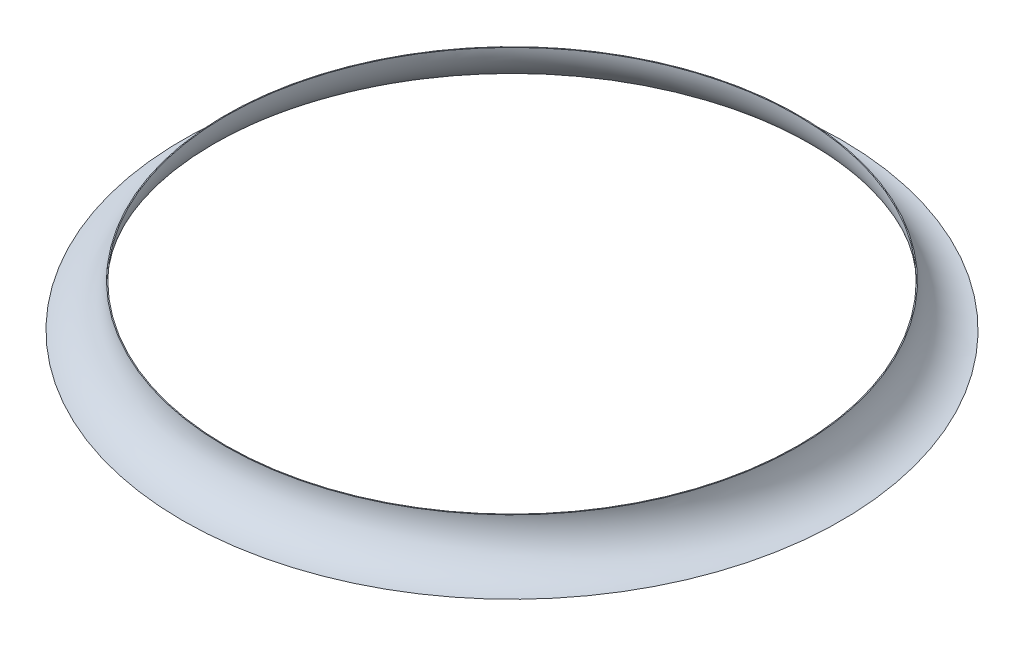
ISO-10303-21;
HEADER;
FILE_DESCRIPTION(('STEP AP214'),'2;1');
FILE_NAME('part.step','',(''),(''),'','','');
FILE_SCHEMA(('AUTOMOTIVE_DESIGN { 1 0 10303 214 1 1 1 1 }'));
ENDSEC;
DATA;
#1=APPLICATION_CONTEXT('core data for automotive mechanical design processes');
#2=APPLICATION_PROTOCOL_DEFINITION('international standard','automotive_design',2000,#1);
#3=PRODUCT_CONTEXT('',#1,'mechanical');
#4=PRODUCT('Part','Part','',(#3));
#5=PRODUCT_RELATED_PRODUCT_CATEGORY('part','',(#4));
#6=PRODUCT_DEFINITION_FORMATION('','',#4);
#7=PRODUCT_DEFINITION_CONTEXT('part definition',#1,'design');
#8=PRODUCT_DEFINITION('design','',#6,#7);
#9=PRODUCT_DEFINITION_SHAPE('','',#8);
#10=(LENGTH_UNIT() NAMED_UNIT(*) SI_UNIT(.MILLI.,.METRE.));
#11=(NAMED_UNIT(*) PLANE_ANGLE_UNIT() SI_UNIT($,.RADIAN.));
#12=(NAMED_UNIT(*) SI_UNIT($,.STERADIAN.) SOLID_ANGLE_UNIT());
#13=UNCERTAINTY_MEASURE_WITH_UNIT(LENGTH_MEASURE(1.E-05),#10,'distance_accuracy_value','');
#14=(GEOMETRIC_REPRESENTATION_CONTEXT(3) GLOBAL_UNCERTAINTY_ASSIGNED_CONTEXT((#13)) GLOBAL_UNIT_ASSIGNED_CONTEXT((#10,
#11,#12)) REPRESENTATION_CONTEXT('',''));
#15=CARTESIAN_POINT('',(0.,0.,0.));
#16=DIRECTION('',(0.,0.,1.));
#17=DIRECTION('',(1.,0.,0.));
#18=AXIS2_PLACEMENT_3D('',#15,#16,#17);
#19=CARTESIAN_POINT('',(0.,-106.348633581109,-1.79823951185946E-13));
#20=DIRECTION('',(0.,1.,0.));
#21=DIRECTION('',(0.,0.,1.));
#22=AXIS2_PLACEMENT_3D('',#19,#20,#21);
#23=PLANE('',#22);
#24=CARTESIAN_POINT('',(0.,-106.348633581109,772.125273510312));
#25=DIRECTION('',(0.,1.,0.));
#26=DIRECTION('',(0.,0.,1.));
#27=AXIS2_PLACEMENT_3D('',#24,#25,#26);
#28=CIRCLE('',#27,923.);
#29=CARTESIAN_POINT('',(0.,-106.348633581109,1695.12527351031));
#30=VERTEX_POINT('',#29);
#31=EDGE_CURVE('E47',#30,#30,#28,.T.);
#32=ORIENTED_EDGE('',*,*,#31,.F.);
#33=EDGE_LOOP('',(#32));
#34=FACE_BOUND('',#33,.T.);
#35=CARTESIAN_POINT('',(0.,-106.348633581109,772.125273510312));
#36=DIRECTION('',(0.,1.,0.));
#37=DIRECTION('',(0.,0.,1.));
#38=AXIS2_PLACEMENT_3D('',#35,#36,#37);
#39=CIRCLE('',#38,898.377855495509);
#40=CARTESIAN_POINT('',(0.,-106.348633581109,1670.50312900582));
#41=VERTEX_POINT('',#40);
#42=EDGE_CURVE('E10',#41,#41,#39,.T.);
#43=ORIENTED_EDGE('',*,*,#42,.T.);
#44=EDGE_LOOP('',(#43));
#45=FACE_BOUND('',#44,.T.);
#46=ADVANCED_FACE('F33',(#34,#45),#23,.F.);
#47=CARTESIAN_POINT('',(0.,13.651366418891,772.125273510312));
#48=DIRECTION('',(0.,1.,0.));
#49=DIRECTION('',(0.,0.,1.));
#50=AXIS2_PLACEMENT_3D('',#47,#48,#49);
#51=TOROIDAL_SURFACE('',#50,923.,122.5);
#52=CARTESIAN_POINT('',(0.,13.651366418891,772.125273510312));
#53=DIRECTION('',(0.,1.,0.));
#54=DIRECTION('',(0.,0.,1.));
#55=AXIS2_PLACEMENT_3D('',#52,#53,#54);
#56=CIRCLE('',#55,800.5);
#57=CARTESIAN_POINT('',(0.,13.651366418891,1572.62527351031));
#58=VERTEX_POINT('',#57);
#59=EDGE_CURVE('E39',#58,#58,#56,.T.);
#60=ORIENTED_EDGE('',*,*,#59,.T.);
#61=EDGE_LOOP('',(#60));
#62=FACE_BOUND('',#61,.T.);
#63=ORIENTED_EDGE('',*,*,#42,.F.);
#64=EDGE_LOOP('',(#63));
#65=FACE_BOUND('',#64,.T.);
#66=ADVANCED_FACE('F56',(#62,#65),#51,.T.);
#67=CARTESIAN_POINT('',(0.,13.651366418891,0.));
#68=DIRECTION('',(0.,1.,0.));
#69=DIRECTION('',(0.,0.,1.));
#70=AXIS2_PLACEMENT_3D('',#67,#68,#69);
#71=PLANE('',#70);
#72=CARTESIAN_POINT('',(0.,13.651366418891,772.125273510312));
#73=DIRECTION('',(0.,1.,0.));
#74=DIRECTION('',(0.,0.,1.));
#75=AXIS2_PLACEMENT_3D('',#72,#73,#74);
#76=CIRCLE('',#75,803.);
#77=CARTESIAN_POINT('',(0.,13.651366418891,1575.12527351031));
#78=VERTEX_POINT('',#77);
#79=EDGE_CURVE('E43',#78,#78,#76,.T.);
#80=ORIENTED_EDGE('',*,*,#79,.T.);
#81=EDGE_LOOP('',(#80));
#82=FACE_BOUND('',#81,.T.);
#83=ORIENTED_EDGE('',*,*,#59,.F.);
#84=EDGE_LOOP('',(#83));
#85=FACE_BOUND('',#84,.T.);
#86=ADVANCED_FACE('F60',(#82,#85),#71,.T.);
#87=CARTESIAN_POINT('',(0.,13.651366418891,772.125273510312));
#88=DIRECTION('',(0.,1.,0.));
#89=DIRECTION('',(0.,0.,1.));
#90=AXIS2_PLACEMENT_3D('',#87,#88,#89);
#91=TOROIDAL_SURFACE('',#90,923.,120.);
#92=ORIENTED_EDGE('',*,*,#79,.F.);
#93=EDGE_LOOP('',(#92));
#94=FACE_BOUND('',#93,.T.);
#95=ORIENTED_EDGE('',*,*,#31,.T.);
#96=EDGE_LOOP('',(#95));
#97=FACE_BOUND('',#96,.T.);
#98=ADVANCED_FACE('F53',(#94,#97),#91,.F.);
#99=CLOSED_SHELL('',(#46,#66,#86,#98));
#100=MANIFOLD_SOLID_BREP('B2',#99);
#101=ADVANCED_BREP_SHAPE_REPRESENTATION('',(#18,#100),#14);
#102=SHAPE_DEFINITION_REPRESENTATION(#9,#101);
ENDSEC;
END-ISO-10303-21;
